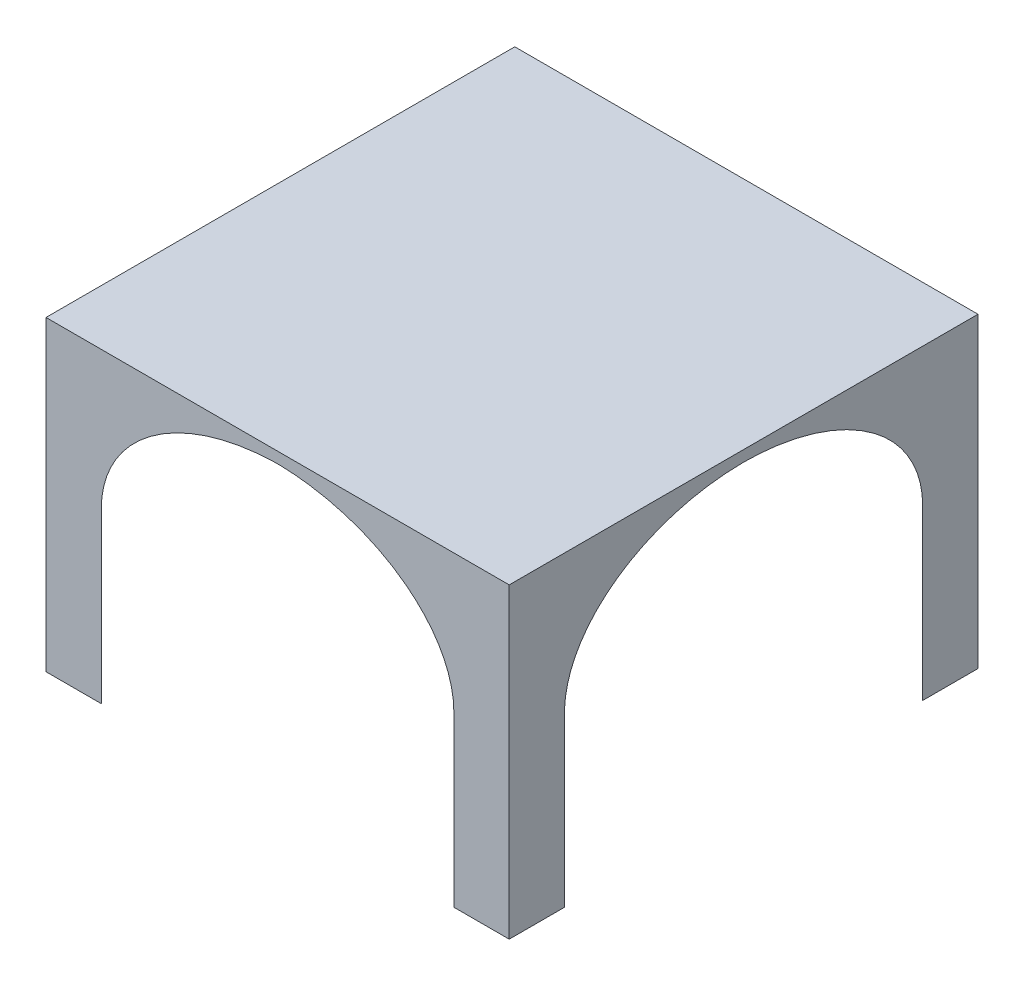
ISO-10303-21;
HEADER;
FILE_DESCRIPTION(('STEP AP214'),'2;1');
FILE_NAME('part.step','',(''),(''),'','','');
FILE_SCHEMA(('AUTOMOTIVE_DESIGN { 1 0 10303 214 1 1 1 1 }'));
ENDSEC;
DATA;
#1=APPLICATION_CONTEXT('core data for automotive mechanical design processes');
#2=APPLICATION_PROTOCOL_DEFINITION('international standard','automotive_design',2000,#1);
#3=PRODUCT_CONTEXT('',#1,'mechanical');
#4=PRODUCT('Part','Part','',(#3));
#5=PRODUCT_RELATED_PRODUCT_CATEGORY('part','',(#4));
#6=PRODUCT_DEFINITION_FORMATION('','',#4);
#7=PRODUCT_DEFINITION_CONTEXT('part definition',#1,'design');
#8=PRODUCT_DEFINITION('design','',#6,#7);
#9=PRODUCT_DEFINITION_SHAPE('','',#8);
#10=(LENGTH_UNIT() NAMED_UNIT(*) SI_UNIT(.MILLI.,.METRE.));
#11=(NAMED_UNIT(*) PLANE_ANGLE_UNIT() SI_UNIT($,.RADIAN.));
#12=(NAMED_UNIT(*) SI_UNIT($,.STERADIAN.) SOLID_ANGLE_UNIT());
#13=UNCERTAINTY_MEASURE_WITH_UNIT(LENGTH_MEASURE(1.E-05),#10,'distance_accuracy_value','');
#14=(GEOMETRIC_REPRESENTATION_CONTEXT(3) GLOBAL_UNCERTAINTY_ASSIGNED_CONTEXT((#13)) GLOBAL_UNIT_ASSIGNED_CONTEXT((#10,
#11,#12)) REPRESENTATION_CONTEXT('',''));
#15=CARTESIAN_POINT('',(0.,0.,0.));
#16=DIRECTION('',(0.,0.,1.));
#17=DIRECTION('',(1.,0.,0.));
#18=AXIS2_PLACEMENT_3D('',#15,#16,#17);
#19=CARTESIAN_POINT('',(-50.633513652379,77.,-155.976486347731));
#20=DIRECTION('',(0.707106781186546,0.,0.707106781186549));
#21=DIRECTION('',(0.707106781186549,0.,-0.707106781186546));
#22=AXIS2_PLACEMENT_3D('',#19,#20,#21);
#23=CYLINDRICAL_SURFACE('',#22,58.);
#24=CARTESIAN_POINT('',(105.342972695351,77.,0.));
#25=DIRECTION('',(-0.707106781186546,0.,-0.707106781186549));
#26=DIRECTION('',(-0.707106781186549,0.,0.707106781186546));
#27=AXIS2_PLACEMENT_3D('',#24,#25,#26);
#28=CIRCLE('',#27,58.);
#29=CARTESIAN_POINT('',(105.342972695351,135.,0.));
#30=VERTEX_POINT('',#29);
#31=CARTESIAN_POINT('',(105.67000000011,134.998156059343,-0.32702730475916));
#32=VERTEX_POINT('',#31);
#33=EDGE_CURVE('E50',#30,#32,#28,.T.);
#34=ORIENTED_EDGE('',*,*,#33,.F.);
#35=DIRECTION('',(0.707106781186546,0.,0.707106781186549));
#36=VECTOR('',#35,1.);
#37=CARTESIAN_POINT('',(-50.633513652379,135.,-155.976486347731));
#38=LINE('',#37,#36);
#39=CARTESIAN_POINT('',(0.,135.,-105.342972695352));
#40=VERTEX_POINT('',#39);
#41=EDGE_CURVE('E546',#40,#30,#38,.T.);
#42=ORIENTED_EDGE('',*,*,#41,.F.);
#43=CARTESIAN_POINT('',(0.,77.,-105.342972695352));
#44=DIRECTION('',(-0.707106781186546,0.,-0.707106781186549));
#45=DIRECTION('',(-0.707106781186549,0.,0.707106781186546));
#46=AXIS2_PLACEMENT_3D('',#43,#44,#45);
#47=CIRCLE('',#46,58.);
#48=CARTESIAN_POINT('',(1.59702730464832,134.95600924474,-106.94));
#49=VERTEX_POINT('',#48);
#50=EDGE_CURVE('E63',#40,#49,#47,.T.);
#51=ORIENTED_EDGE('',*,*,#50,.T.);
#52=CARTESIAN_POINT('',(-1.59702730464826,77.,-106.94));
#53=DIRECTION('',(0.,0.,-1.));
#54=DIRECTION('',(1.,0.,0.));
#55=AXIS2_PLACEMENT_3D('',#52,#53,#54);
#56=ELLIPSE('',#55,82.0243866176394,58.);
#57=CARTESIAN_POINT('',(80.427359312991,77.,-106.94));
#58=VERTEX_POINT('',#57);
#59=EDGE_CURVE('E558',#58,#49,#56,.F.);
#60=ORIENTED_EDGE('',*,*,#59,.F.);
#61=DIRECTION('',(0.707106781186546,0.,0.707106781186549));
#62=VECTOR('',#61,1.);
#63=CARTESIAN_POINT('',(105.67000000011,77.,-81.6973593128807));
#64=LINE('',#63,#62);
#65=CARTESIAN_POINT('',(105.67000000011,77.,-81.6973593128807));
#66=VERTEX_POINT('',#65);
#67=EDGE_CURVE('E550',#66,#58,#64,.F.);
#68=ORIENTED_EDGE('',*,*,#67,.F.);
#69=CARTESIAN_POINT('',(105.67000000011,77.,0.327027304759031));
#70=DIRECTION('',(1.,0.,0.));
#71=DIRECTION('',(0.,0.,1.));
#72=AXIS2_PLACEMENT_3D('',#69,#70,#71);
#73=ELLIPSE('',#72,82.0243866176397,58.);
#74=EDGE_CURVE('E562',#32,#66,#73,.F.);
#75=ORIENTED_EDGE('',*,*,#74,.F.);
#76=EDGE_LOOP('',(#34,#42,#51,#60,#68,#75));
#77=FACE_BOUND('',#76,.T.);
#78=ADVANCED_FACE('F41',(#77),#23,.F.);
#79=CARTESIAN_POINT('',(0.,77.,-105.342972695352));
#80=DIRECTION('',(-0.707106781186549,0.,0.707106781186546));
#81=DIRECTION('',(0.707106781186546,0.,0.707106781186549));
#82=AXIS2_PLACEMENT_3D('',#79,#80,#81);
#83=SPHERICAL_SURFACE('',#82,58.);
#84=ORIENTED_EDGE('',*,*,#50,.F.);
#85=CARTESIAN_POINT('',(0.,77.,-105.342972695352));
#86=DIRECTION('',(-0.707106781186546,0.,0.707106781186549));
#87=DIRECTION('',(0.707106781186549,0.,0.707106781186546));
#88=AXIS2_PLACEMENT_3D('',#85,#86,#87);
#89=CIRCLE('',#88,58.);
#90=CARTESIAN_POINT('',(-1.5970273046483,134.95600924474,-106.94));
#91=VERTEX_POINT('',#90);
#92=EDGE_CURVE('E542',#91,#40,#89,.F.);
#93=ORIENTED_EDGE('',*,*,#92,.F.);
#94=CARTESIAN_POINT('',(0.,77.,-106.94));
#95=DIRECTION('',(0.,0.,-1.));
#96=DIRECTION('',(-1.,0.,0.));
#97=AXIS2_PLACEMENT_3D('',#94,#95,#96);
#98=CIRCLE('',#97,57.9780087946129);
#99=EDGE_CURVE('E565',#91,#49,#98,.T.);
#100=ORIENTED_EDGE('',*,*,#99,.T.);
#101=EDGE_LOOP('',(#84,#93,#100));
#102=FACE_BOUND('',#101,.T.);
#103=ADVANCED_FACE('F621',(#102),#83,.F.);
#104=CARTESIAN_POINT('',(105.342972695351,77.,0.));
#105=DIRECTION('',(-0.707106781186549,0.,0.707106781186546));
#106=DIRECTION('',(0.707106781186546,0.,0.707106781186549));
#107=AXIS2_PLACEMENT_3D('',#104,#105,#106);
#108=SPHERICAL_SURFACE('',#107,58.);
#109=CARTESIAN_POINT('',(105.342972695351,77.,0.));
#110=DIRECTION('',(-0.707106781186546,0.,0.707106781186549));
#111=DIRECTION('',(0.707106781186549,0.,0.707106781186546));
#112=AXIS2_PLACEMENT_3D('',#109,#110,#111);
#113=CIRCLE('',#112,58.);
#114=CARTESIAN_POINT('',(105.67000000011,134.998156059343,0.327027304759017));
#115=VERTEX_POINT('',#114);
#116=EDGE_CURVE('E554',#30,#115,#113,.F.);
#117=ORIENTED_EDGE('',*,*,#116,.F.);
#118=ORIENTED_EDGE('',*,*,#33,.T.);
#119=CARTESIAN_POINT('',(105.67000000011,77.,0.));
#120=DIRECTION('',(1.,0.,0.));
#121=DIRECTION('',(0.,0.,-1.));
#122=AXIS2_PLACEMENT_3D('',#119,#120,#121);
#123=CIRCLE('',#122,57.9990780369994);
#124=EDGE_CURVE('E11',#32,#115,#123,.T.);
#125=ORIENTED_EDGE('',*,*,#124,.T.);
#126=EDGE_LOOP('',(#117,#118,#125));
#127=FACE_BOUND('',#126,.T.);
#128=ADVANCED_FACE('F43',(#127),#108,.F.);
#129=CARTESIAN_POINT('',(-39.4151660041711,77.,-65.9278066911803));
#130=DIRECTION('',(-0.707106781186546,0.,0.707106781186549));
#131=DIRECTION('',(0.707106781186549,0.,0.707106781186546));
#132=AXIS2_PLACEMENT_3D('',#129,#130,#131);
#133=CYLINDRICAL_SURFACE('',#132,58.);
#134=CARTESIAN_POINT('',(1.59702730464827,77.,-106.94));
#135=DIRECTION('',(0.,0.,-1.));
#136=DIRECTION('',(-1.,0.,0.));
#137=AXIS2_PLACEMENT_3D('',#134,#135,#136);
#138=ELLIPSE('',#137,82.0243866176393,58.);
#139=CARTESIAN_POINT('',(-80.427359312991,77.,-106.94));
#140=VERTEX_POINT('',#139);
#141=EDGE_CURVE('E532',#140,#91,#138,.T.);
#142=ORIENTED_EDGE('',*,*,#141,.T.);
#143=ORIENTED_EDGE('',*,*,#92,.T.);
#144=DIRECTION('',(-0.707106781186546,0.,0.707106781186549));
#145=VECTOR('',#144,1.);
#146=CARTESIAN_POINT('',(-52.0364863477307,135.,-53.3064863476207));
#147=LINE('',#146,#145);
#148=CARTESIAN_POINT('',(-105.342972695351,135.,0.));
#149=VERTEX_POINT('',#148);
#150=EDGE_CURVE('E520',#149,#40,#147,.F.);
#151=ORIENTED_EDGE('',*,*,#150,.F.);
#152=CARTESIAN_POINT('',(-105.342972695351,77.,0.));
#153=DIRECTION('',(0.707106781186546,0.,-0.707106781186549));
#154=DIRECTION('',(-0.707106781186549,0.,-0.707106781186546));
#155=AXIS2_PLACEMENT_3D('',#152,#153,#154);
#156=CIRCLE('',#155,58.);
#157=CARTESIAN_POINT('',(-105.67000000011,134.998156059343,-0.32702730475903));
#158=VERTEX_POINT('',#157);
#159=EDGE_CURVE('E536',#158,#149,#156,.T.);
#160=ORIENTED_EDGE('',*,*,#159,.F.);
#161=CARTESIAN_POINT('',(-105.67000000011,77.,0.327027304759087));
#162=DIRECTION('',(-1.,0.,0.));
#163=DIRECTION('',(0.,0.,1.));
#164=AXIS2_PLACEMENT_3D('',#161,#162,#163);
#165=ELLIPSE('',#164,82.0243866176397,58.);
#166=CARTESIAN_POINT('',(-105.67000000011,77.,-81.6973593128807));
#167=VERTEX_POINT('',#166);
#168=EDGE_CURVE('E528',#167,#158,#165,.F.);
#169=ORIENTED_EDGE('',*,*,#168,.F.);
#170=DIRECTION('',(-0.707106781186546,0.,0.707106781186549));
#171=VECTOR('',#170,1.);
#172=CARTESIAN_POINT('',(-80.427359312991,77.,-106.94));
#173=LINE('',#172,#171);
#174=EDGE_CURVE('E516',#140,#167,#173,.T.);
#175=ORIENTED_EDGE('',*,*,#174,.F.);
#176=EDGE_LOOP('',(#142,#143,#151,#160,#169,#175));
#177=FACE_BOUND('',#176,.T.);
#178=ADVANCED_FACE('F617',(#177),#133,.F.);
#179=CARTESIAN_POINT('',(-105.342972695351,77.,0.));
#180=DIRECTION('',(0.707106781186549,0.,0.707106781186546));
#181=DIRECTION('',(0.707106781186546,0.,-0.707106781186549));
#182=AXIS2_PLACEMENT_3D('',#179,#180,#181);
#183=SPHERICAL_SURFACE('',#182,58.);
#184=CARTESIAN_POINT('',(-105.342972695351,77.,0.));
#185=DIRECTION('',(0.707106781186546,0.,0.707106781186549));
#186=DIRECTION('',(0.707106781186549,0.,-0.707106781186546));
#187=AXIS2_PLACEMENT_3D('',#184,#185,#186);
#188=CIRCLE('',#187,58.);
#189=CARTESIAN_POINT('',(-105.67000000011,134.998156059343,0.327027304759058));
#190=VERTEX_POINT('',#189);
#191=EDGE_CURVE('E524',#190,#149,#188,.F.);
#192=ORIENTED_EDGE('',*,*,#191,.F.);
#193=CARTESIAN_POINT('',(-105.67000000011,77.,0.));
#194=DIRECTION('',(-1.,0.,0.));
#195=DIRECTION('',(0.,0.,1.));
#196=AXIS2_PLACEMENT_3D('',#193,#194,#195);
#197=CIRCLE('',#196,57.9990780369994);
#198=EDGE_CURVE('E539',#190,#158,#197,.T.);
#199=ORIENTED_EDGE('',*,*,#198,.T.);
#200=ORIENTED_EDGE('',*,*,#159,.T.);
#201=EDGE_LOOP('',(#192,#199,#200));
#202=FACE_BOUND('',#201,.T.);
#203=ADVANCED_FACE('F655',(#202),#183,.F.);
#204=CARTESIAN_POINT('',(53.3064863476209,77.,52.0364863477304));
#205=DIRECTION('',(-0.707106781186546,0.,0.707106781186549));
#206=DIRECTION('',(0.707106781186549,0.,0.707106781186546));
#207=AXIS2_PLACEMENT_3D('',#204,#205,#206);
#208=CYLINDRICAL_SURFACE('',#207,58.);
#209=DIRECTION('',(-0.707106781186546,0.,0.707106781186549));
#210=VECTOR('',#209,1.);
#211=CARTESIAN_POINT('',(53.3064863476209,135.,52.0364863477304));
#212=LINE('',#211,#210);
#213=CARTESIAN_POINT('',(0.,135.,105.342972695352));
#214=VERTEX_POINT('',#213);
#215=EDGE_CURVE('E492',#30,#214,#212,.T.);
#216=ORIENTED_EDGE('',*,*,#215,.F.);
#217=ORIENTED_EDGE('',*,*,#116,.T.);
#218=CARTESIAN_POINT('',(105.67000000011,77.,-0.327027304759087));
#219=DIRECTION('',(1.,0.,0.));
#220=DIRECTION('',(0.,0.,1.));
#221=AXIS2_PLACEMENT_3D('',#218,#219,#220);
#222=ELLIPSE('',#221,82.0243866176397,58.);
#223=CARTESIAN_POINT('',(105.67000000011,77.,81.6973593128807));
#224=VERTEX_POINT('',#223);
#225=EDGE_CURVE('E506',#115,#224,#222,.T.);
#226=ORIENTED_EDGE('',*,*,#225,.T.);
#227=DIRECTION('',(-0.707106781186546,0.,0.707106781186549));
#228=VECTOR('',#227,1.);
#229=CARTESIAN_POINT('',(80.427359312991,77.,106.94));
#230=LINE('',#229,#228);
#231=CARTESIAN_POINT('',(80.427359312991,77.,106.94));
#232=VERTEX_POINT('',#231);
#233=EDGE_CURVE('E495',#232,#224,#230,.F.);
#234=ORIENTED_EDGE('',*,*,#233,.F.);
#235=CARTESIAN_POINT('',(-1.59702730464836,77.,106.94));
#236=DIRECTION('',(0.,0.,1.));
#237=DIRECTION('',(-1.,0.,0.));
#238=AXIS2_PLACEMENT_3D('',#235,#236,#237);
#239=ELLIPSE('',#238,82.0243866176393,58.);
#240=CARTESIAN_POINT('',(1.59702730464838,134.95600924474,106.94));
#241=VERTEX_POINT('',#240);
#242=EDGE_CURVE('E503',#241,#232,#239,.F.);
#243=ORIENTED_EDGE('',*,*,#242,.F.);
#244=CARTESIAN_POINT('',(0.,77.,105.342972695352));
#245=DIRECTION('',(0.707106781186546,0.,-0.707106781186549));
#246=DIRECTION('',(-0.707106781186549,0.,-0.707106781186546));
#247=AXIS2_PLACEMENT_3D('',#244,#245,#246);
#248=CIRCLE('',#247,58.);
#249=EDGE_CURVE('E509',#214,#241,#248,.T.);
#250=ORIENTED_EDGE('',*,*,#249,.F.);
#251=EDGE_LOOP('',(#216,#217,#226,#234,#243,#250));
#252=FACE_BOUND('',#251,.T.);
#253=ADVANCED_FACE('F608',(#252),#208,.F.);
#254=CARTESIAN_POINT('',(0.,77.,105.342972695352));
#255=DIRECTION('',(-0.707106781186549,0.,-0.707106781186546));
#256=DIRECTION('',(-0.707106781186546,0.,0.707106781186549));
#257=AXIS2_PLACEMENT_3D('',#254,#255,#256);
#258=SPHERICAL_SURFACE('',#257,58.);
#259=CARTESIAN_POINT('',(0.,77.,105.342972695352));
#260=DIRECTION('',(0.707106781186546,0.,0.707106781186549));
#261=DIRECTION('',(0.707106781186549,0.,-0.707106781186546));
#262=AXIS2_PLACEMENT_3D('',#259,#260,#261);
#263=CIRCLE('',#262,58.);
#264=CARTESIAN_POINT('',(-1.59702730464881,134.95600924474,106.94));
#265=VERTEX_POINT('',#264);
#266=EDGE_CURVE('E499',#214,#265,#263,.T.);
#267=ORIENTED_EDGE('',*,*,#266,.F.);
#268=ORIENTED_EDGE('',*,*,#249,.T.);
#269=CARTESIAN_POINT('',(0.,77.,106.94));
#270=DIRECTION('',(0.,0.,1.));
#271=DIRECTION('',(1.,0.,0.));
#272=AXIS2_PLACEMENT_3D('',#269,#270,#271);
#273=CIRCLE('',#272,57.9780087946129);
#274=EDGE_CURVE('E513',#241,#265,#273,.T.);
#275=ORIENTED_EDGE('',*,*,#274,.T.);
#276=EDGE_LOOP('',(#267,#268,#275));
#277=FACE_BOUND('',#276,.T.);
#278=ADVANCED_FACE('F647',(#277),#258,.F.);
#279=CARTESIAN_POINT('',(-64.6578066912903,77.,40.685166004061));
#280=DIRECTION('',(0.707106781186546,0.,0.707106781186549));
#281=DIRECTION('',(0.707106781186549,0.,-0.707106781186546));
#282=AXIS2_PLACEMENT_3D('',#279,#280,#281);
#283=CYLINDRICAL_SURFACE('',#282,58.);
#284=CARTESIAN_POINT('',(-105.67000000011,77.,-0.327027304759066));
#285=DIRECTION('',(-1.,0.,0.));
#286=DIRECTION('',(0.,0.,1.));
#287=AXIS2_PLACEMENT_3D('',#284,#285,#286);
#288=ELLIPSE('',#287,82.0243866176397,58.);
#289=CARTESIAN_POINT('',(-105.67000000011,77.,81.6973593128807));
#290=VERTEX_POINT('',#289);
#291=EDGE_CURVE('E485',#290,#190,#288,.T.);
#292=ORIENTED_EDGE('',*,*,#291,.T.);
#293=ORIENTED_EDGE('',*,*,#191,.T.);
#294=DIRECTION('',(0.707106781186546,0.,0.707106781186549));
#295=VECTOR('',#294,1.);
#296=CARTESIAN_POINT('',(-155.976486347731,135.,-50.6335136523798));
#297=LINE('',#296,#295);
#298=EDGE_CURVE('E481',#214,#149,#297,.F.);
#299=ORIENTED_EDGE('',*,*,#298,.F.);
#300=ORIENTED_EDGE('',*,*,#266,.T.);
#301=CARTESIAN_POINT('',(1.59702730464832,77.,106.94));
#302=DIRECTION('',(0.,0.,1.));
#303=DIRECTION('',(1.,0.,0.));
#304=AXIS2_PLACEMENT_3D('',#301,#302,#303);
#305=ELLIPSE('',#304,82.0243866176393,58.);
#306=CARTESIAN_POINT('',(-80.427359312991,77.,106.94));
#307=VERTEX_POINT('',#306);
#308=EDGE_CURVE('E489',#265,#307,#305,.T.);
#309=ORIENTED_EDGE('',*,*,#308,.T.);
#310=DIRECTION('',(0.707106781186546,0.,0.707106781186549));
#311=VECTOR('',#310,1.);
#312=CARTESIAN_POINT('',(-105.67000000011,77.,81.6973593128807));
#313=LINE('',#312,#311);
#314=EDGE_CURVE('E472',#290,#307,#313,.T.);
#315=ORIENTED_EDGE('',*,*,#314,.F.);
#316=EDGE_LOOP('',(#292,#293,#299,#300,#309,#315));
#317=FACE_BOUND('',#316,.T.);
#318=ADVANCED_FACE('F645',(#317),#283,.F.);
#319=CARTESIAN_POINT('',(-102.67000000011,135.,-103.94));
#320=DIRECTION('',(0.,1.,0.));
#321=DIRECTION('',(0.,0.,1.));
#322=AXIS2_PLACEMENT_3D('',#319,#320,#321);
#323=PLANE('',#322);
#324=ORIENTED_EDGE('',*,*,#150,.T.);
#325=ORIENTED_EDGE('',*,*,#41,.T.);
#326=ORIENTED_EDGE('',*,*,#215,.T.);
#327=ORIENTED_EDGE('',*,*,#298,.T.);
#328=EDGE_LOOP('',(#324,#325,#326,#327));
#329=FACE_BOUND('',#328,.T.);
#330=ADVANCED_FACE('F612',(#329),#323,.F.);
#331=CARTESIAN_POINT('',(0.,140.,0.));
#332=DIRECTION('',(0.,1.,0.));
#333=DIRECTION('',(0.,0.,1.));
#334=AXIS2_PLACEMENT_3D('',#331,#332,#333);
#335=PLANE('',#334);
#336=DIRECTION('',(-1.,0.,0.));
#337=VECTOR('',#336,1.);
#338=CARTESIAN_POINT('',(-80.427359312991,140.,106.94));
#339=LINE('',#338,#337);
#340=CARTESIAN_POINT('',(105.67000000011,140.,106.94));
#341=VERTEX_POINT('',#340);
#342=CARTESIAN_POINT('',(-105.67000000011,140.,106.94));
#343=VERTEX_POINT('',#342);
#344=EDGE_CURVE('E450',#341,#343,#339,.T.);
#345=ORIENTED_EDGE('',*,*,#344,.F.);
#346=DIRECTION('',(0.,0.,1.));
#347=VECTOR('',#346,1.);
#348=CARTESIAN_POINT('',(105.67000000011,140.,81.6973593128807));
#349=LINE('',#348,#347);
#350=CARTESIAN_POINT('',(105.67000000011,140.,-106.94));
#351=VERTEX_POINT('',#350);
#352=EDGE_CURVE('E425',#351,#341,#349,.T.);
#353=ORIENTED_EDGE('',*,*,#352,.F.);
#354=DIRECTION('',(1.,0.,0.));
#355=VECTOR('',#354,1.);
#356=CARTESIAN_POINT('',(-105.67000000011,140.,-106.94));
#357=LINE('',#356,#355);
#358=CARTESIAN_POINT('',(-105.67000000011,140.,-106.94));
#359=VERTEX_POINT('',#358);
#360=EDGE_CURVE('E400',#359,#351,#357,.T.);
#361=ORIENTED_EDGE('',*,*,#360,.F.);
#362=DIRECTION('',(0.,0.,-1.));
#363=VECTOR('',#362,1.);
#364=CARTESIAN_POINT('',(-105.67000000011,140.,106.94));
#365=LINE('',#364,#363);
#366=EDGE_CURVE('E454',#343,#359,#365,.T.);
#367=ORIENTED_EDGE('',*,*,#366,.F.);
#368=EDGE_LOOP('',(#345,#353,#361,#367));
#369=FACE_BOUND('',#368,.T.);
#370=ADVANCED_FACE('F592',(#369),#335,.T.);
#371=CARTESIAN_POINT('',(-105.67000000011,140.,81.6973593128807));
#372=DIRECTION('',(0.707106781186549,0.,-0.707106781186546));
#373=DIRECTION('',(-0.707106781186546,0.,-0.707106781186549));
#374=AXIS2_PLACEMENT_3D('',#371,#372,#373);
#375=PLANE('',#374);
#376=DIRECTION('',(0.,-1.,0.));
#377=VECTOR('',#376,1.);
#378=CARTESIAN_POINT('',(-105.67000000011,140.,81.6973593128807));
#379=LINE('',#378,#377);
#380=CARTESIAN_POINT('',(-105.67000000011,0.,81.6973593128807));
#381=VERTEX_POINT('',#380);
#382=EDGE_CURVE('E469',#290,#381,#379,.T.);
#383=ORIENTED_EDGE('',*,*,#382,.F.);
#384=ORIENTED_EDGE('',*,*,#314,.T.);
#385=DIRECTION('',(0.,-1.,0.));
#386=VECTOR('',#385,1.);
#387=CARTESIAN_POINT('',(-80.427359312991,140.,106.94));
#388=LINE('',#387,#386);
#389=CARTESIAN_POINT('',(-80.427359312991,0.,106.94));
#390=VERTEX_POINT('',#389);
#391=EDGE_CURVE('E458',#307,#390,#388,.T.);
#392=ORIENTED_EDGE('',*,*,#391,.T.);
#393=DIRECTION('',(0.707106781186546,0.,0.707106781186549));
#394=VECTOR('',#393,1.);
#395=CARTESIAN_POINT('',(-105.67000000011,0.,81.6973593128807));
#396=LINE('',#395,#394);
#397=EDGE_CURVE('E444',#381,#390,#396,.T.);
#398=ORIENTED_EDGE('',*,*,#397,.F.);
#399=EDGE_LOOP('',(#383,#384,#392,#398));
#400=FACE_BOUND('',#399,.T.);
#401=ADVANCED_FACE('F641',(#400),#375,.T.);
#402=CARTESIAN_POINT('',(-105.67000000011,140.,106.94));
#403=DIRECTION('',(-1.,0.,0.));
#404=DIRECTION('',(0.,0.,1.));
#405=AXIS2_PLACEMENT_3D('',#402,#403,#404);
#406=PLANE('',#405);
#407=ORIENTED_EDGE('',*,*,#198,.F.);
#408=ORIENTED_EDGE('',*,*,#291,.F.);
#409=ORIENTED_EDGE('',*,*,#382,.T.);
#410=DIRECTION('',(0.,0.,-1.));
#411=VECTOR('',#410,1.);
#412=CARTESIAN_POINT('',(-105.67000000011,0.,106.94));
#413=LINE('',#412,#411);
#414=CARTESIAN_POINT('',(-105.67000000011,0.,106.94));
#415=VERTEX_POINT('',#414);
#416=EDGE_CURVE('E455',#415,#381,#413,.T.);
#417=ORIENTED_EDGE('',*,*,#416,.F.);
#418=DIRECTION('',(0.,-1.,0.));
#419=VECTOR('',#418,1.);
#420=CARTESIAN_POINT('',(-105.67000000011,140.,106.94));
#421=LINE('',#420,#419);
#422=EDGE_CURVE('E473',#343,#415,#421,.T.);
#423=ORIENTED_EDGE('',*,*,#422,.F.);
#424=ORIENTED_EDGE('',*,*,#366,.T.);
#425=DIRECTION('',(0.,-1.,0.));
#426=VECTOR('',#425,1.);
#427=CARTESIAN_POINT('',(-105.67000000011,140.,-106.94));
#428=LINE('',#427,#426);
#429=CARTESIAN_POINT('',(-105.67000000011,0.,-106.94));
#430=VERTEX_POINT('',#429);
#431=EDGE_CURVE('E404',#359,#430,#428,.T.);
#432=ORIENTED_EDGE('',*,*,#431,.T.);
#433=DIRECTION('',(0.,0.,-1.));
#434=VECTOR('',#433,1.);
#435=CARTESIAN_POINT('',(-105.67000000011,0.,-81.6973593128807));
#436=LINE('',#435,#434);
#437=CARTESIAN_POINT('',(-105.67000000011,0.,-81.6973593128807));
#438=VERTEX_POINT('',#437);
#439=EDGE_CURVE('E394',#438,#430,#436,.T.);
#440=ORIENTED_EDGE('',*,*,#439,.F.);
#441=DIRECTION('',(0.,-1.,0.));
#442=VECTOR('',#441,1.);
#443=CARTESIAN_POINT('',(-105.67000000011,140.,-81.6973593128807));
#444=LINE('',#443,#442);
#445=EDGE_CURVE('E416',#167,#438,#444,.T.);
#446=ORIENTED_EDGE('',*,*,#445,.F.);
#447=ORIENTED_EDGE('',*,*,#168,.T.);
#448=EDGE_LOOP('',(#407,#408,#409,#417,#423,#424,#432,#440,#446,#447));
#449=FACE_BOUND('',#448,.T.);
#450=ADVANCED_FACE('F632',(#449),#406,.T.);
#451=CARTESIAN_POINT('',(-80.427359312991,140.,106.94));
#452=DIRECTION('',(0.,0.,1.));
#453=DIRECTION('',(1.,0.,0.));
#454=AXIS2_PLACEMENT_3D('',#451,#452,#453);
#455=PLANE('',#454);
#456=ORIENTED_EDGE('',*,*,#242,.T.);
#457=DIRECTION('',(0.,-1.,0.));
#458=VECTOR('',#457,1.);
#459=CARTESIAN_POINT('',(80.427359312991,140.,106.94));
#460=LINE('',#459,#458);
#461=CARTESIAN_POINT('',(80.427359312991,0.,106.94));
#462=VERTEX_POINT('',#461);
#463=EDGE_CURVE('E441',#232,#462,#460,.T.);
#464=ORIENTED_EDGE('',*,*,#463,.T.);
#465=DIRECTION('',(-1.,0.,0.));
#466=VECTOR('',#465,1.);
#467=CARTESIAN_POINT('',(105.67000000011,0.,106.94));
#468=LINE('',#467,#466);
#469=CARTESIAN_POINT('',(105.67000000011,0.,106.94));
#470=VERTEX_POINT('',#469);
#471=EDGE_CURVE('E430',#470,#462,#468,.T.);
#472=ORIENTED_EDGE('',*,*,#471,.F.);
#473=DIRECTION('',(0.,-1.,0.));
#474=VECTOR('',#473,1.);
#475=CARTESIAN_POINT('',(105.67000000011,140.,106.94));
#476=LINE('',#475,#474);
#477=EDGE_CURVE('E445',#341,#470,#476,.T.);
#478=ORIENTED_EDGE('',*,*,#477,.F.);
#479=ORIENTED_EDGE('',*,*,#344,.T.);
#480=ORIENTED_EDGE('',*,*,#422,.T.);
#481=DIRECTION('',(-1.,0.,0.));
#482=VECTOR('',#481,1.);
#483=CARTESIAN_POINT('',(-80.427359312991,0.,106.94));
#484=LINE('',#483,#482);
#485=EDGE_CURVE('E462',#390,#415,#484,.T.);
#486=ORIENTED_EDGE('',*,*,#485,.F.);
#487=ORIENTED_EDGE('',*,*,#391,.F.);
#488=ORIENTED_EDGE('',*,*,#308,.F.);
#489=ORIENTED_EDGE('',*,*,#274,.F.);
#490=EDGE_LOOP('',(#456,#464,#472,#478,#479,#480,#486,#487,#488,#489));
#491=FACE_BOUND('',#490,.T.);
#492=ADVANCED_FACE('F596',(#491),#455,.T.);
#493=CARTESIAN_POINT('',(0.,0.,0.));
#494=DIRECTION('',(0.,1.,0.));
#495=DIRECTION('',(0.,0.,1.));
#496=AXIS2_PLACEMENT_3D('',#493,#494,#495);
#497=PLANE('',#496);
#498=DIRECTION('',(0.707106781186546,0.,0.707106781186549));
#499=VECTOR('',#498,1.);
#500=CARTESIAN_POINT('',(-102.97000000011,0.,88.215735931288));
#501=LINE('',#500,#499);
#502=CARTESIAN_POINT('',(-102.97000000011,0.,88.2157359312881));
#503=VERTEX_POINT('',#502);
#504=CARTESIAN_POINT('',(-86.9457359313983,0.,104.24));
#505=VERTEX_POINT('',#504);
#506=EDGE_CURVE('E362',#503,#505,#501,.T.);
#507=ORIENTED_EDGE('',*,*,#506,.F.);
#508=DIRECTION('',(0.,0.,-1.));
#509=VECTOR('',#508,1.);
#510=CARTESIAN_POINT('',(-102.97000000011,0.,104.24));
#511=LINE('',#510,#509);
#512=CARTESIAN_POINT('',(-102.97000000011,0.,104.24));
#513=VERTEX_POINT('',#512);
#514=EDGE_CURVE('E278',#513,#503,#511,.T.);
#515=ORIENTED_EDGE('',*,*,#514,.F.);
#516=DIRECTION('',(-1.,0.,0.));
#517=VECTOR('',#516,1.);
#518=CARTESIAN_POINT('',(-86.9457359313983,0.,104.24));
#519=LINE('',#518,#517);
#520=EDGE_CURVE('E351',#505,#513,#519,.T.);
#521=ORIENTED_EDGE('',*,*,#520,.F.);
#522=EDGE_LOOP('',(#507,#515,#521));
#523=FACE_BOUND('',#522,.T.);
#524=ORIENTED_EDGE('',*,*,#397,.T.);
#525=ORIENTED_EDGE('',*,*,#485,.T.);
#526=ORIENTED_EDGE('',*,*,#416,.T.);
#527=EDGE_LOOP('',(#524,#525,#526));
#528=FACE_BOUND('',#527,.T.);
#529=ADVANCED_FACE('F637',(#523,#528),#497,.F.);
#530=CARTESIAN_POINT('',(80.427359312991,140.,106.94));
#531=DIRECTION('',(-0.707106781186549,0.,-0.707106781186546));
#532=DIRECTION('',(-0.707106781186546,0.,0.707106781186549));
#533=AXIS2_PLACEMENT_3D('',#530,#531,#532);
#534=PLANE('',#533);
#535=ORIENTED_EDGE('',*,*,#463,.F.);
#536=ORIENTED_EDGE('',*,*,#233,.T.);
#537=DIRECTION('',(0.,-1.,0.));
#538=VECTOR('',#537,1.);
#539=CARTESIAN_POINT('',(105.67000000011,140.,81.6973593128807));
#540=LINE('',#539,#538);
#541=CARTESIAN_POINT('',(105.67000000011,0.,81.6973593128807));
#542=VERTEX_POINT('',#541);
#543=EDGE_CURVE('E429',#224,#542,#540,.T.);
#544=ORIENTED_EDGE('',*,*,#543,.T.);
#545=DIRECTION('',(0.707106781186546,0.,-0.707106781186549));
#546=VECTOR('',#545,1.);
#547=CARTESIAN_POINT('',(80.427359312991,0.,106.94));
#548=LINE('',#547,#546);
#549=EDGE_CURVE('E419',#462,#542,#548,.T.);
#550=ORIENTED_EDGE('',*,*,#549,.F.);
#551=EDGE_LOOP('',(#535,#536,#544,#550));
#552=FACE_BOUND('',#551,.T.);
#553=ADVANCED_FACE('F603',(#552),#534,.T.);
#554=CARTESIAN_POINT('',(105.67000000011,140.,81.6973593128807));
#555=DIRECTION('',(1.,0.,0.));
#556=DIRECTION('',(0.,0.,-1.));
#557=AXIS2_PLACEMENT_3D('',#554,#555,#556);
#558=PLANE('',#557);
#559=ORIENTED_EDGE('',*,*,#74,.T.);
#560=DIRECTION('',(0.,-1.,0.));
#561=VECTOR('',#560,1.);
#562=CARTESIAN_POINT('',(105.67000000011,140.,-81.6973593128807));
#563=LINE('',#562,#561);
#564=CARTESIAN_POINT('',(105.67000000011,0.,-81.6973593128807));
#565=VERTEX_POINT('',#564);
#566=EDGE_CURVE('E391',#66,#565,#563,.T.);
#567=ORIENTED_EDGE('',*,*,#566,.T.);
#568=DIRECTION('',(0.,0.,1.));
#569=VECTOR('',#568,1.);
#570=CARTESIAN_POINT('',(105.67000000011,0.,-106.94));
#571=LINE('',#570,#569);
#572=CARTESIAN_POINT('',(105.67000000011,0.,-106.94));
#573=VERTEX_POINT('',#572);
#574=EDGE_CURVE('E386',#573,#565,#571,.T.);
#575=ORIENTED_EDGE('',*,*,#574,.F.);
#576=DIRECTION('',(0.,-1.,0.));
#577=VECTOR('',#576,1.);
#578=CARTESIAN_POINT('',(105.67000000011,140.,-106.94));
#579=LINE('',#578,#577);
#580=EDGE_CURVE('E395',#351,#573,#579,.T.);
#581=ORIENTED_EDGE('',*,*,#580,.F.);
#582=ORIENTED_EDGE('',*,*,#352,.T.);
#583=ORIENTED_EDGE('',*,*,#477,.T.);
#584=DIRECTION('',(0.,0.,1.));
#585=VECTOR('',#584,1.);
#586=CARTESIAN_POINT('',(105.67000000011,0.,81.6973593128807));
#587=LINE('',#586,#585);
#588=EDGE_CURVE('E434',#542,#470,#587,.T.);
#589=ORIENTED_EDGE('',*,*,#588,.F.);
#590=ORIENTED_EDGE('',*,*,#543,.F.);
#591=ORIENTED_EDGE('',*,*,#225,.F.);
#592=ORIENTED_EDGE('',*,*,#124,.F.);
#593=EDGE_LOOP('',(#559,#567,#575,#581,#582,#583,#589,#590,#591,#592));
#594=FACE_BOUND('',#593,.T.);
#595=ADVANCED_FACE('F575',(#594),#558,.T.);
#596=CARTESIAN_POINT('',(0.,0.,0.));
#597=DIRECTION('',(0.,1.,0.));
#598=DIRECTION('',(0.,0.,1.));
#599=AXIS2_PLACEMENT_3D('',#596,#597,#598);
#600=PLANE('',#599);
#601=DIRECTION('',(0.707106781186546,0.,-0.707106781186549));
#602=VECTOR('',#601,1.);
#603=CARTESIAN_POINT('',(86.9457359313983,0.,104.24));
#604=LINE('',#603,#602);
#605=CARTESIAN_POINT('',(86.9457359313983,0.,104.24));
#606=VERTEX_POINT('',#605);
#607=CARTESIAN_POINT('',(102.97000000011,0.,88.215735931288));
#608=VERTEX_POINT('',#607);
#609=EDGE_CURVE('E265',#606,#608,#604,.T.);
#610=ORIENTED_EDGE('',*,*,#609,.F.);
#611=DIRECTION('',(-1.,0.,0.));
#612=VECTOR('',#611,1.);
#613=CARTESIAN_POINT('',(102.97000000011,0.,104.24));
#614=LINE('',#613,#612);
#615=CARTESIAN_POINT('',(102.97000000011,0.,104.24));
#616=VERTEX_POINT('',#615);
#617=EDGE_CURVE('E244',#616,#606,#614,.T.);
#618=ORIENTED_EDGE('',*,*,#617,.F.);
#619=DIRECTION('',(0.,0.,1.));
#620=VECTOR('',#619,1.);
#621=CARTESIAN_POINT('',(102.97000000011,0.,88.215735931288));
#622=LINE('',#621,#620);
#623=EDGE_CURVE('E261',#608,#616,#622,.T.);
#624=ORIENTED_EDGE('',*,*,#623,.F.);
#625=EDGE_LOOP('',(#610,#618,#624));
#626=FACE_BOUND('',#625,.T.);
#627=ORIENTED_EDGE('',*,*,#549,.T.);
#628=ORIENTED_EDGE('',*,*,#588,.T.);
#629=ORIENTED_EDGE('',*,*,#471,.T.);
#630=EDGE_LOOP('',(#627,#628,#629));
#631=FACE_BOUND('',#630,.T.);
#632=ADVANCED_FACE('F600',(#626,#631),#600,.F.);
#633=CARTESIAN_POINT('',(-80.427359312991,140.,-106.94));
#634=DIRECTION('',(0.707106781186549,0.,0.707106781186546));
#635=DIRECTION('',(0.707106781186546,0.,-0.707106781186549));
#636=AXIS2_PLACEMENT_3D('',#633,#634,#635);
#637=PLANE('',#636);
#638=DIRECTION('',(0.,-1.,0.));
#639=VECTOR('',#638,1.);
#640=CARTESIAN_POINT('',(-80.427359312991,140.,-106.94));
#641=LINE('',#640,#639);
#642=CARTESIAN_POINT('',(-80.427359312991,0.,-106.94));
#643=VERTEX_POINT('',#642);
#644=EDGE_CURVE('E420',#140,#643,#641,.T.);
#645=ORIENTED_EDGE('',*,*,#644,.F.);
#646=ORIENTED_EDGE('',*,*,#174,.T.);
#647=ORIENTED_EDGE('',*,*,#445,.T.);
#648=DIRECTION('',(-0.707106781186546,0.,0.707106781186549));
#649=VECTOR('',#648,1.);
#650=CARTESIAN_POINT('',(-80.427359312991,0.,-106.94));
#651=LINE('',#650,#649);
#652=EDGE_CURVE('E405',#643,#438,#651,.T.);
#653=ORIENTED_EDGE('',*,*,#652,.F.);
#654=EDGE_LOOP('',(#645,#646,#647,#653));
#655=FACE_BOUND('',#654,.T.);
#656=ADVANCED_FACE('F627',(#655),#637,.T.);
#657=CARTESIAN_POINT('',(-105.67000000011,140.,-106.94));
#658=DIRECTION('',(0.,0.,-1.));
#659=DIRECTION('',(-1.,0.,0.));
#660=AXIS2_PLACEMENT_3D('',#657,#658,#659);
#661=PLANE('',#660);
#662=ORIENTED_EDGE('',*,*,#99,.F.);
#663=ORIENTED_EDGE('',*,*,#141,.F.);
#664=ORIENTED_EDGE('',*,*,#644,.T.);
#665=DIRECTION('',(1.,0.,0.));
#666=VECTOR('',#665,1.);
#667=CARTESIAN_POINT('',(-105.67000000011,0.,-106.94));
#668=LINE('',#667,#666);
#669=EDGE_CURVE('E409',#430,#643,#668,.T.);
#670=ORIENTED_EDGE('',*,*,#669,.F.);
#671=ORIENTED_EDGE('',*,*,#431,.F.);
#672=ORIENTED_EDGE('',*,*,#360,.T.);
#673=ORIENTED_EDGE('',*,*,#580,.T.);
#674=DIRECTION('',(1.,0.,0.));
#675=VECTOR('',#674,1.);
#676=CARTESIAN_POINT('',(80.427359312991,0.,-106.94));
#677=LINE('',#676,#675);
#678=CARTESIAN_POINT('',(80.427359312991,0.,-106.94));
#679=VERTEX_POINT('',#678);
#680=EDGE_CURVE('E382',#679,#573,#677,.T.);
#681=ORIENTED_EDGE('',*,*,#680,.F.);
#682=DIRECTION('',(0.,-1.,0.));
#683=VECTOR('',#682,1.);
#684=CARTESIAN_POINT('',(80.427359312991,140.,-106.94));
#685=LINE('',#684,#683);
#686=EDGE_CURVE('E390',#58,#679,#685,.T.);
#687=ORIENTED_EDGE('',*,*,#686,.F.);
#688=ORIENTED_EDGE('',*,*,#59,.T.);
#689=EDGE_LOOP('',(#662,#663,#664,#670,#671,#672,#673,#681,#687,#688));
#690=FACE_BOUND('',#689,.T.);
#691=ADVANCED_FACE('F586',(#690),#661,.T.);
#692=CARTESIAN_POINT('',(0.,0.,0.));
#693=DIRECTION('',(0.,1.,0.));
#694=DIRECTION('',(0.,0.,1.));
#695=AXIS2_PLACEMENT_3D('',#692,#693,#694);
#696=PLANE('',#695);
#697=DIRECTION('',(0.,0.,-1.));
#698=VECTOR('',#697,1.);
#699=CARTESIAN_POINT('',(-102.97000000011,0.,-88.215735931288));
#700=LINE('',#699,#698);
#701=CARTESIAN_POINT('',(-102.97000000011,0.,-88.215735931288));
#702=VERTEX_POINT('',#701);
#703=CARTESIAN_POINT('',(-102.97000000011,0.,-104.24));
#704=VERTEX_POINT('',#703);
#705=EDGE_CURVE('E331',#702,#704,#700,.T.);
#706=ORIENTED_EDGE('',*,*,#705,.F.);
#707=DIRECTION('',(-0.707106781186546,0.,0.707106781186549));
#708=VECTOR('',#707,1.);
#709=CARTESIAN_POINT('',(-86.9457359313983,0.,-104.24));
#710=LINE('',#709,#708);
#711=CARTESIAN_POINT('',(-86.9457359313983,0.,-104.24));
#712=VERTEX_POINT('',#711);
#713=EDGE_CURVE('E328',#712,#702,#710,.T.);
#714=ORIENTED_EDGE('',*,*,#713,.F.);
#715=DIRECTION('',(1.,0.,0.));
#716=VECTOR('',#715,1.);
#717=CARTESIAN_POINT('',(-102.97000000011,0.,-104.24));
#718=LINE('',#717,#716);
#719=EDGE_CURVE('E319',#704,#712,#718,.T.);
#720=ORIENTED_EDGE('',*,*,#719,.F.);
#721=EDGE_LOOP('',(#706,#714,#720));
#722=FACE_BOUND('',#721,.T.);
#723=ORIENTED_EDGE('',*,*,#439,.T.);
#724=ORIENTED_EDGE('',*,*,#669,.T.);
#725=ORIENTED_EDGE('',*,*,#652,.T.);
#726=EDGE_LOOP('',(#723,#724,#725));
#727=FACE_BOUND('',#726,.T.);
#728=ADVANCED_FACE('F630',(#722,#727),#696,.F.);
#729=CARTESIAN_POINT('',(105.67000000011,140.,-81.6973593128807));
#730=DIRECTION('',(-0.707106781186549,0.,0.707106781186546));
#731=DIRECTION('',(0.707106781186546,0.,0.707106781186549));
#732=AXIS2_PLACEMENT_3D('',#729,#730,#731);
#733=PLANE('',#732);
#734=ORIENTED_EDGE('',*,*,#566,.F.);
#735=ORIENTED_EDGE('',*,*,#67,.T.);
#736=ORIENTED_EDGE('',*,*,#686,.T.);
#737=DIRECTION('',(-0.707106781186546,0.,-0.707106781186549));
#738=VECTOR('',#737,1.);
#739=CARTESIAN_POINT('',(105.67000000011,0.,-81.6973593128807));
#740=LINE('',#739,#738);
#741=EDGE_CURVE('E372',#565,#679,#740,.T.);
#742=ORIENTED_EDGE('',*,*,#741,.F.);
#743=EDGE_LOOP('',(#734,#735,#736,#742));
#744=FACE_BOUND('',#743,.T.);
#745=ADVANCED_FACE('F580',(#744),#733,.T.);
#746=CARTESIAN_POINT('',(0.,0.,0.));
#747=DIRECTION('',(0.,1.,0.));
#748=DIRECTION('',(0.,0.,1.));
#749=AXIS2_PLACEMENT_3D('',#746,#747,#748);
#750=PLANE('',#749);
#751=DIRECTION('',(-0.707106781186546,0.,-0.707106781186549));
#752=VECTOR('',#751,1.);
#753=CARTESIAN_POINT('',(102.97000000011,0.,-88.215735931288));
#754=LINE('',#753,#752);
#755=CARTESIAN_POINT('',(102.97000000011,0.,-88.2157359312881));
#756=VERTEX_POINT('',#755);
#757=CARTESIAN_POINT('',(86.9457359313983,0.,-104.24));
#758=VERTEX_POINT('',#757);
#759=EDGE_CURVE('E298',#756,#758,#754,.T.);
#760=ORIENTED_EDGE('',*,*,#759,.F.);
#761=DIRECTION('',(0.,0.,1.));
#762=VECTOR('',#761,1.);
#763=CARTESIAN_POINT('',(102.97000000011,0.,-104.24));
#764=LINE('',#763,#762);
#765=CARTESIAN_POINT('',(102.97000000011,0.,-104.24));
#766=VERTEX_POINT('',#765);
#767=EDGE_CURVE('E295',#766,#756,#764,.T.);
#768=ORIENTED_EDGE('',*,*,#767,.F.);
#769=DIRECTION('',(1.,0.,0.));
#770=VECTOR('',#769,1.);
#771=CARTESIAN_POINT('',(86.9457359313983,0.,-104.24));
#772=LINE('',#771,#770);
#773=EDGE_CURVE('E286',#758,#766,#772,.T.);
#774=ORIENTED_EDGE('',*,*,#773,.F.);
#775=EDGE_LOOP('',(#760,#768,#774));
#776=FACE_BOUND('',#775,.T.);
#777=ORIENTED_EDGE('',*,*,#741,.T.);
#778=ORIENTED_EDGE('',*,*,#680,.T.);
#779=ORIENTED_EDGE('',*,*,#574,.T.);
#780=EDGE_LOOP('',(#777,#778,#779));
#781=FACE_BOUND('',#780,.T.);
#782=ADVANCED_FACE('F584',(#776,#781),#750,.F.);
#783=CARTESIAN_POINT('',(102.97000000011,70.,-104.24));
#784=DIRECTION('',(1.,0.,0.));
#785=DIRECTION('',(0.,0.,-1.));
#786=AXIS2_PLACEMENT_3D('',#783,#784,#785);
#787=PLANE('',#786);
#788=ORIENTED_EDGE('',*,*,#767,.T.);
#789=DIRECTION('',(0.,-1.,0.));
#790=VECTOR('',#789,1.);
#791=CARTESIAN_POINT('',(102.97000000011,70.,-88.215735931288));
#792=LINE('',#791,#790);
#793=CARTESIAN_POINT('',(102.97000000011,70.,-88.215735931288));
#794=VERTEX_POINT('',#793);
#795=EDGE_CURVE('E294',#794,#756,#792,.T.);
#796=ORIENTED_EDGE('',*,*,#795,.F.);
#797=DIRECTION('',(0.,0.,1.));
#798=VECTOR('',#797,1.);
#799=CARTESIAN_POINT('',(102.97000000011,70.,-104.24));
#800=LINE('',#799,#798);
#801=CARTESIAN_POINT('',(102.97000000011,70.,-104.24));
#802=VERTEX_POINT('',#801);
#803=EDGE_CURVE('E281',#802,#794,#800,.T.);
#804=ORIENTED_EDGE('',*,*,#803,.F.);
#805=DIRECTION('',(0.,-1.,0.));
#806=VECTOR('',#805,1.);
#807=CARTESIAN_POINT('',(102.97000000011,70.,-104.24));
#808=LINE('',#807,#806);
#809=EDGE_CURVE('E272',#802,#766,#808,.T.);
#810=ORIENTED_EDGE('',*,*,#809,.T.);
#811=EDGE_LOOP('',(#788,#796,#804,#810));
#812=FACE_BOUND('',#811,.T.);
#813=ADVANCED_FACE('F907',(#812),#787,.F.);
#814=CARTESIAN_POINT('',(86.9457359313983,70.,-104.24));
#815=DIRECTION('',(0.,0.,-1.));
#816=DIRECTION('',(-1.,0.,0.));
#817=AXIS2_PLACEMENT_3D('',#814,#815,#816);
#818=PLANE('',#817);
#819=ORIENTED_EDGE('',*,*,#773,.T.);
#820=ORIENTED_EDGE('',*,*,#809,.F.);
#821=DIRECTION('',(1.,0.,0.));
#822=VECTOR('',#821,1.);
#823=CARTESIAN_POINT('',(86.9457359313983,70.,-104.24));
#824=LINE('',#823,#822);
#825=CARTESIAN_POINT('',(86.9457359313983,70.,-104.24));
#826=VERTEX_POINT('',#825);
#827=EDGE_CURVE('E290',#826,#802,#824,.T.);
#828=ORIENTED_EDGE('',*,*,#827,.F.);
#829=DIRECTION('',(0.,-1.,0.));
#830=VECTOR('',#829,1.);
#831=CARTESIAN_POINT('',(86.9457359313983,70.,-104.24));
#832=LINE('',#831,#830);
#833=EDGE_CURVE('E308',#826,#758,#832,.T.);
#834=ORIENTED_EDGE('',*,*,#833,.T.);
#835=EDGE_LOOP('',(#819,#820,#828,#834));
#836=FACE_BOUND('',#835,.T.);
#837=ADVANCED_FACE('F897',(#836),#818,.F.);
#838=CARTESIAN_POINT('',(102.97000000011,70.,-88.215735931288));
#839=DIRECTION('',(-0.707106781186549,0.,0.707106781186546));
#840=DIRECTION('',(0.707106781186546,0.,0.707106781186549));
#841=AXIS2_PLACEMENT_3D('',#838,#839,#840);
#842=PLANE('',#841);
#843=ORIENTED_EDGE('',*,*,#759,.T.);
#844=ORIENTED_EDGE('',*,*,#833,.F.);
#845=DIRECTION('',(-0.707106781186546,0.,-0.707106781186549));
#846=VECTOR('',#845,1.);
#847=CARTESIAN_POINT('',(102.97000000011,70.,-88.215735931288));
#848=LINE('',#847,#846);
#849=EDGE_CURVE('E285',#794,#826,#848,.T.);
#850=ORIENTED_EDGE('',*,*,#849,.F.);
#851=ORIENTED_EDGE('',*,*,#795,.T.);
#852=EDGE_LOOP('',(#843,#844,#850,#851));
#853=FACE_BOUND('',#852,.T.);
#854=ADVANCED_FACE('F887',(#853),#842,.F.);
#855=CARTESIAN_POINT('',(0.,70.,0.));
#856=DIRECTION('',(0.,1.,0.));
#857=DIRECTION('',(0.,0.,1.));
#858=AXIS2_PLACEMENT_3D('',#855,#856,#857);
#859=PLANE('',#858);
#860=ORIENTED_EDGE('',*,*,#803,.T.);
#861=ORIENTED_EDGE('',*,*,#849,.T.);
#862=ORIENTED_EDGE('',*,*,#827,.T.);
#863=EDGE_LOOP('',(#860,#861,#862));
#864=FACE_BOUND('',#863,.T.);
#865=ADVANCED_FACE('F877',(#864),#859,.F.);
#866=CARTESIAN_POINT('',(-86.9457359313983,70.,-104.24));
#867=DIRECTION('',(0.707106781186549,0.,0.707106781186546));
#868=DIRECTION('',(0.707106781186546,0.,-0.707106781186549));
#869=AXIS2_PLACEMENT_3D('',#866,#867,#868);
#870=PLANE('',#869);
#871=ORIENTED_EDGE('',*,*,#713,.T.);
#872=DIRECTION('',(0.,-1.,0.));
#873=VECTOR('',#872,1.);
#874=CARTESIAN_POINT('',(-102.97000000011,70.,-88.215735931288));
#875=LINE('',#874,#873);
#876=CARTESIAN_POINT('',(-102.97000000011,70.,-88.215735931288));
#877=VERTEX_POINT('',#876);
#878=EDGE_CURVE('E327',#877,#702,#875,.T.);
#879=ORIENTED_EDGE('',*,*,#878,.F.);
#880=DIRECTION('',(-0.707106781186546,0.,0.707106781186549));
#881=VECTOR('',#880,1.);
#882=CARTESIAN_POINT('',(-86.9457359313983,70.,-104.24));
#883=LINE('',#882,#881);
#884=CARTESIAN_POINT('',(-86.9457359313983,70.,-104.24));
#885=VERTEX_POINT('',#884);
#886=EDGE_CURVE('E314',#885,#877,#883,.T.);
#887=ORIENTED_EDGE('',*,*,#886,.F.);
#888=DIRECTION('',(0.,-1.,0.));
#889=VECTOR('',#888,1.);
#890=CARTESIAN_POINT('',(-86.9457359313983,70.,-104.24));
#891=LINE('',#890,#889);
#892=EDGE_CURVE('E299',#885,#712,#891,.T.);
#893=ORIENTED_EDGE('',*,*,#892,.T.);
#894=EDGE_LOOP('',(#871,#879,#887,#893));
#895=FACE_BOUND('',#894,.T.);
#896=ADVANCED_FACE('F867',(#895),#870,.F.);
#897=CARTESIAN_POINT('',(-102.97000000011,70.,-104.24));
#898=DIRECTION('',(0.,0.,-1.));
#899=DIRECTION('',(-1.,0.,0.));
#900=AXIS2_PLACEMENT_3D('',#897,#898,#899);
#901=PLANE('',#900);
#902=ORIENTED_EDGE('',*,*,#719,.T.);
#903=ORIENTED_EDGE('',*,*,#892,.F.);
#904=DIRECTION('',(1.,0.,0.));
#905=VECTOR('',#904,1.);
#906=CARTESIAN_POINT('',(-102.97000000011,70.,-104.24));
#907=LINE('',#906,#905);
#908=CARTESIAN_POINT('',(-102.97000000011,70.,-104.24));
#909=VERTEX_POINT('',#908);
#910=EDGE_CURVE('E323',#909,#885,#907,.T.);
#911=ORIENTED_EDGE('',*,*,#910,.F.);
#912=DIRECTION('',(0.,-1.,0.));
#913=VECTOR('',#912,1.);
#914=CARTESIAN_POINT('',(-102.97000000011,70.,-104.24));
#915=LINE('',#914,#913);
#916=EDGE_CURVE('E340',#909,#704,#915,.T.);
#917=ORIENTED_EDGE('',*,*,#916,.T.);
#918=EDGE_LOOP('',(#902,#903,#911,#917));
#919=FACE_BOUND('',#918,.T.);
#920=ADVANCED_FACE('F857',(#919),#901,.F.);
#921=CARTESIAN_POINT('',(-102.97000000011,70.,-88.215735931288));
#922=DIRECTION('',(-1.,0.,0.));
#923=DIRECTION('',(0.,0.,1.));
#924=AXIS2_PLACEMENT_3D('',#921,#922,#923);
#925=PLANE('',#924);
#926=ORIENTED_EDGE('',*,*,#705,.T.);
#927=ORIENTED_EDGE('',*,*,#916,.F.);
#928=DIRECTION('',(0.,0.,-1.));
#929=VECTOR('',#928,1.);
#930=CARTESIAN_POINT('',(-102.97000000011,70.,-88.215735931288));
#931=LINE('',#930,#929);
#932=EDGE_CURVE('E318',#877,#909,#931,.T.);
#933=ORIENTED_EDGE('',*,*,#932,.F.);
#934=ORIENTED_EDGE('',*,*,#878,.T.);
#935=EDGE_LOOP('',(#926,#927,#933,#934));
#936=FACE_BOUND('',#935,.T.);
#937=ADVANCED_FACE('F847',(#936),#925,.F.);
#938=CARTESIAN_POINT('',(0.,70.,0.));
#939=DIRECTION('',(0.,-1.,0.));
#940=DIRECTION('',(0.,0.,-1.));
#941=AXIS2_PLACEMENT_3D('',#938,#939,#940);
#942=PLANE('',#941);
#943=ORIENTED_EDGE('',*,*,#886,.T.);
#944=ORIENTED_EDGE('',*,*,#932,.T.);
#945=ORIENTED_EDGE('',*,*,#910,.T.);
#946=EDGE_LOOP('',(#943,#944,#945));
#947=FACE_BOUND('',#946,.T.);
#948=ADVANCED_FACE('F838',(#947),#942,.T.);
#949=CARTESIAN_POINT('',(102.97000000011,70.,104.24));
#950=DIRECTION('',(0.,0.,1.));
#951=DIRECTION('',(1.,0.,0.));
#952=AXIS2_PLACEMENT_3D('',#949,#950,#951);
#953=PLANE('',#952);
#954=ORIENTED_EDGE('',*,*,#617,.T.);
#955=DIRECTION('',(0.,-1.,0.));
#956=VECTOR('',#955,1.);
#957=CARTESIAN_POINT('',(86.9457359313983,70.,104.24));
#958=LINE('',#957,#956);
#959=CARTESIAN_POINT('',(86.9457359313983,70.,104.24));
#960=VERTEX_POINT('',#959);
#961=EDGE_CURVE('E237',#960,#606,#958,.T.);
#962=ORIENTED_EDGE('',*,*,#961,.F.);
#963=DIRECTION('',(-1.,0.,0.));
#964=VECTOR('',#963,1.);
#965=CARTESIAN_POINT('',(102.97000000011,70.,104.24));
#966=LINE('',#965,#964);
#967=CARTESIAN_POINT('',(102.97000000011,70.,104.24));
#968=VERTEX_POINT('',#967);
#969=EDGE_CURVE('E241',#968,#960,#966,.T.);
#970=ORIENTED_EDGE('',*,*,#969,.F.);
#971=DIRECTION('',(0.,-1.,0.));
#972=VECTOR('',#971,1.);
#973=CARTESIAN_POINT('',(102.97000000011,70.,104.24));
#974=LINE('',#973,#972);
#975=EDGE_CURVE('E275',#968,#616,#974,.T.);
#976=ORIENTED_EDGE('',*,*,#975,.T.);
#977=EDGE_LOOP('',(#954,#962,#970,#976));
#978=FACE_BOUND('',#977,.T.);
#979=ADVANCED_FACE('F239',(#978),#953,.F.);
#980=CARTESIAN_POINT('',(102.97000000011,70.,88.215735931288));
#981=DIRECTION('',(1.,0.,0.));
#982=DIRECTION('',(0.,0.,-1.));
#983=AXIS2_PLACEMENT_3D('',#980,#981,#982);
#984=PLANE('',#983);
#985=ORIENTED_EDGE('',*,*,#623,.T.);
#986=ORIENTED_EDGE('',*,*,#975,.F.);
#987=DIRECTION('',(0.,0.,1.));
#988=VECTOR('',#987,1.);
#989=CARTESIAN_POINT('',(102.97000000011,70.,88.215735931288));
#990=LINE('',#989,#988);
#991=CARTESIAN_POINT('',(102.97000000011,70.,88.215735931288));
#992=VERTEX_POINT('',#991);
#993=EDGE_CURVE('E250',#992,#968,#990,.T.);
#994=ORIENTED_EDGE('',*,*,#993,.F.);
#995=DIRECTION('',(0.,-1.,0.));
#996=VECTOR('',#995,1.);
#997=CARTESIAN_POINT('',(102.97000000011,70.,88.215735931288));
#998=LINE('',#997,#996);
#999=EDGE_CURVE('E249',#992,#608,#998,.T.);
#1000=ORIENTED_EDGE('',*,*,#999,.T.);
#1001=EDGE_LOOP('',(#985,#986,#994,#1000));
#1002=FACE_BOUND('',#1001,.T.);
#1003=ADVANCED_FACE('F820',(#1002),#984,.F.);
#1004=CARTESIAN_POINT('',(86.9457359313983,70.,104.24));
#1005=DIRECTION('',(-0.707106781186549,0.,-0.707106781186546));
#1006=DIRECTION('',(-0.707106781186546,0.,0.707106781186549));
#1007=AXIS2_PLACEMENT_3D('',#1004,#1005,#1006);
#1008=PLANE('',#1007);
#1009=ORIENTED_EDGE('',*,*,#609,.T.);
#1010=ORIENTED_EDGE('',*,*,#999,.F.);
#1011=DIRECTION('',(0.707106781186546,0.,-0.707106781186549));
#1012=VECTOR('',#1011,1.);
#1013=CARTESIAN_POINT('',(86.9457359313983,70.,104.24));
#1014=LINE('',#1013,#1012);
#1015=EDGE_CURVE('E253',#960,#992,#1014,.T.);
#1016=ORIENTED_EDGE('',*,*,#1015,.F.);
#1017=ORIENTED_EDGE('',*,*,#961,.T.);
#1018=EDGE_LOOP('',(#1009,#1010,#1016,#1017));
#1019=FACE_BOUND('',#1018,.T.);
#1020=ADVANCED_FACE('F254',(#1019),#1008,.F.);
#1021=CARTESIAN_POINT('',(0.,70.,0.));
#1022=DIRECTION('',(0.,1.,0.));
#1023=DIRECTION('',(0.,0.,1.));
#1024=AXIS2_PLACEMENT_3D('',#1021,#1022,#1023);
#1025=PLANE('',#1024);
#1026=ORIENTED_EDGE('',*,*,#969,.T.);
#1027=ORIENTED_EDGE('',*,*,#1015,.T.);
#1028=ORIENTED_EDGE('',*,*,#993,.T.);
#1029=EDGE_LOOP('',(#1026,#1027,#1028));
#1030=FACE_BOUND('',#1029,.T.);
#1031=ADVANCED_FACE('F259',(#1030),#1025,.F.);
#1032=CARTESIAN_POINT('',(-102.97000000011,70.,104.24));
#1033=DIRECTION('',(-1.,0.,0.));
#1034=DIRECTION('',(0.,0.,1.));
#1035=AXIS2_PLACEMENT_3D('',#1032,#1033,#1034);
#1036=PLANE('',#1035);
#1037=ORIENTED_EDGE('',*,*,#514,.T.);
#1038=DIRECTION('',(0.,-1.,0.));
#1039=VECTOR('',#1038,1.);
#1040=CARTESIAN_POINT('',(-102.97000000011,70.,88.215735931288));
#1041=LINE('',#1040,#1039);
#1042=CARTESIAN_POINT('',(-102.97000000011,70.,88.215735931288));
#1043=VERTEX_POINT('',#1042);
#1044=EDGE_CURVE('E359',#1043,#503,#1041,.T.);
#1045=ORIENTED_EDGE('',*,*,#1044,.F.);
#1046=DIRECTION('',(0.,0.,-1.));
#1047=VECTOR('',#1046,1.);
#1048=CARTESIAN_POINT('',(-102.97000000011,70.,104.24));
#1049=LINE('',#1048,#1047);
#1050=CARTESIAN_POINT('',(-102.97000000011,70.,104.24));
#1051=VERTEX_POINT('',#1050);
#1052=EDGE_CURVE('E346',#1051,#1043,#1049,.T.);
#1053=ORIENTED_EDGE('',*,*,#1052,.F.);
#1054=DIRECTION('',(0.,-1.,0.));
#1055=VECTOR('',#1054,1.);
#1056=CARTESIAN_POINT('',(-102.97000000011,70.,104.24));
#1057=LINE('',#1056,#1055);
#1058=EDGE_CURVE('E369',#1051,#513,#1057,.T.);
#1059=ORIENTED_EDGE('',*,*,#1058,.T.);
#1060=EDGE_LOOP('',(#1037,#1045,#1053,#1059));
#1061=FACE_BOUND('',#1060,.T.);
#1062=ADVANCED_FACE('F793',(#1061),#1036,.F.);
#1063=CARTESIAN_POINT('',(-86.9457359313983,70.,104.24));
#1064=DIRECTION('',(0.,0.,1.));
#1065=DIRECTION('',(1.,0.,0.));
#1066=AXIS2_PLACEMENT_3D('',#1063,#1064,#1065);
#1067=PLANE('',#1066);
#1068=ORIENTED_EDGE('',*,*,#520,.T.);
#1069=ORIENTED_EDGE('',*,*,#1058,.F.);
#1070=DIRECTION('',(-1.,0.,0.));
#1071=VECTOR('',#1070,1.);
#1072=CARTESIAN_POINT('',(-86.9457359313983,70.,104.24));
#1073=LINE('',#1072,#1071);
#1074=CARTESIAN_POINT('',(-86.9457359313983,70.,104.24));
#1075=VERTEX_POINT('',#1074);
#1076=EDGE_CURVE('E355',#1075,#1051,#1073,.T.);
#1077=ORIENTED_EDGE('',*,*,#1076,.F.);
#1078=DIRECTION('',(0.,-1.,0.));
#1079=VECTOR('',#1078,1.);
#1080=CARTESIAN_POINT('',(-86.9457359313983,70.,104.24));
#1081=LINE('',#1080,#1079);
#1082=EDGE_CURVE('E373',#1075,#505,#1081,.T.);
#1083=ORIENTED_EDGE('',*,*,#1082,.T.);
#1084=EDGE_LOOP('',(#1068,#1069,#1077,#1083));
#1085=FACE_BOUND('',#1084,.T.);
#1086=ADVANCED_FACE('F783',(#1085),#1067,.F.);
#1087=CARTESIAN_POINT('',(-102.97000000011,70.,88.215735931288));
#1088=DIRECTION('',(0.707106781186549,0.,-0.707106781186546));
#1089=DIRECTION('',(-0.707106781186546,0.,-0.707106781186549));
#1090=AXIS2_PLACEMENT_3D('',#1087,#1088,#1089);
#1091=PLANE('',#1090);
#1092=ORIENTED_EDGE('',*,*,#506,.T.);
#1093=ORIENTED_EDGE('',*,*,#1082,.F.);
#1094=DIRECTION('',(0.707106781186546,0.,0.707106781186549));
#1095=VECTOR('',#1094,1.);
#1096=CARTESIAN_POINT('',(-102.97000000011,70.,88.215735931288));
#1097=LINE('',#1096,#1095);
#1098=EDGE_CURVE('E350',#1043,#1075,#1097,.T.);
#1099=ORIENTED_EDGE('',*,*,#1098,.F.);
#1100=ORIENTED_EDGE('',*,*,#1044,.T.);
#1101=EDGE_LOOP('',(#1092,#1093,#1099,#1100));
#1102=FACE_BOUND('',#1101,.T.);
#1103=ADVANCED_FACE('F772',(#1102),#1091,.F.);
#1104=CARTESIAN_POINT('',(0.,70.,0.));
#1105=DIRECTION('',(0.,1.,0.));
#1106=DIRECTION('',(0.,0.,1.));
#1107=AXIS2_PLACEMENT_3D('',#1104,#1105,#1106);
#1108=PLANE('',#1107);
#1109=ORIENTED_EDGE('',*,*,#1052,.T.);
#1110=ORIENTED_EDGE('',*,*,#1098,.T.);
#1111=ORIENTED_EDGE('',*,*,#1076,.T.);
#1112=EDGE_LOOP('',(#1109,#1110,#1111));
#1113=FACE_BOUND('',#1112,.T.);
#1114=ADVANCED_FACE('F767',(#1113),#1108,.F.);
#1115=CLOSED_SHELL('',(#78,#103,#128,#178,#203,#253,#278,#318,#330,#370,#401,#450,#492,#529,
#553,#595,#632,#656,#691,#728,#745,#782,#813,#837,#854,#865,#896,#920,#937,#948,#979,#1003,
#1020,#1031,#1062,#1086,#1103,#1114));
#1116=MANIFOLD_SOLID_BREP('B2',#1115);
#1117=ADVANCED_BREP_SHAPE_REPRESENTATION('',(#18,#1116),#14);
#1118=SHAPE_DEFINITION_REPRESENTATION(#9,#1117);
ENDSEC;
END-ISO-10303-21;
